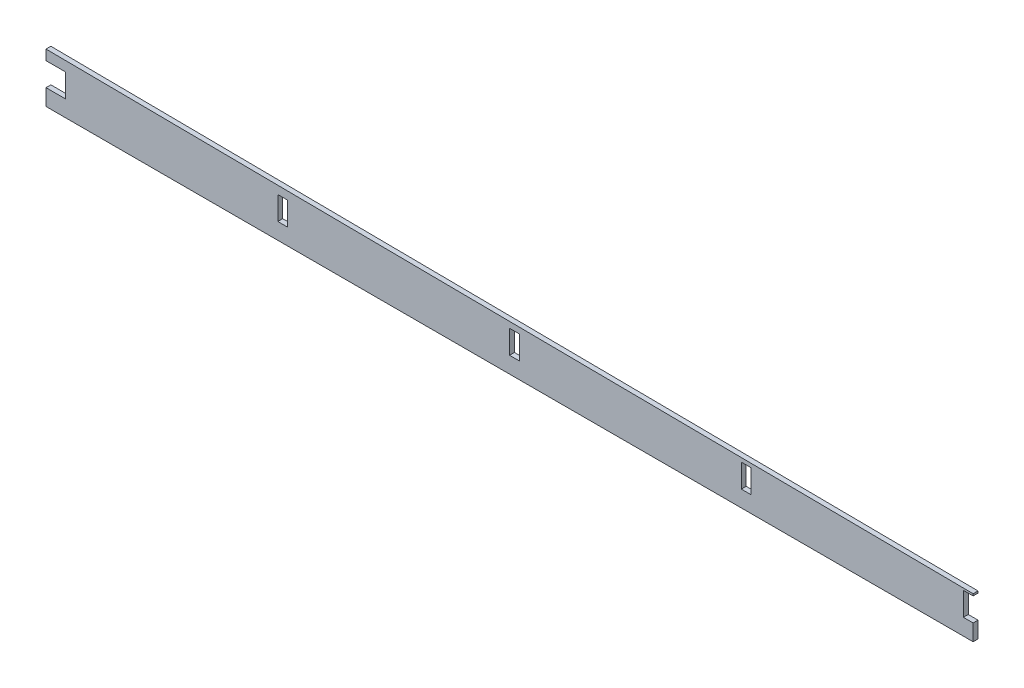
ISO-10303-21;
HEADER;
FILE_DESCRIPTION(('STEP AP214'),'2;1');
FILE_NAME('part.step','',(''),(''),'','','');
FILE_SCHEMA(('AUTOMOTIVE_DESIGN { 1 0 10303 214 1 1 1 1 }'));
ENDSEC;
DATA;
#1=APPLICATION_CONTEXT('core data for automotive mechanical design processes');
#2=APPLICATION_PROTOCOL_DEFINITION('international standard','automotive_design',2000,#1);
#3=PRODUCT_CONTEXT('',#1,'mechanical');
#4=PRODUCT('Part','Part','',(#3));
#5=PRODUCT_RELATED_PRODUCT_CATEGORY('part','',(#4));
#6=PRODUCT_DEFINITION_FORMATION('','',#4);
#7=PRODUCT_DEFINITION_CONTEXT('part definition',#1,'design');
#8=PRODUCT_DEFINITION('design','',#6,#7);
#9=PRODUCT_DEFINITION_SHAPE('','',#8);
#10=(LENGTH_UNIT() NAMED_UNIT(*) SI_UNIT(.MILLI.,.METRE.));
#11=(NAMED_UNIT(*) PLANE_ANGLE_UNIT() SI_UNIT($,.RADIAN.));
#12=(NAMED_UNIT(*) SI_UNIT($,.STERADIAN.) SOLID_ANGLE_UNIT());
#13=UNCERTAINTY_MEASURE_WITH_UNIT(LENGTH_MEASURE(1.E-05),#10,'distance_accuracy_value','');
#14=(GEOMETRIC_REPRESENTATION_CONTEXT(3) GLOBAL_UNCERTAINTY_ASSIGNED_CONTEXT((#13)) GLOBAL_UNIT_ASSIGNED_CONTEXT((#10,
#11,#12)) REPRESENTATION_CONTEXT('',''));
#15=CARTESIAN_POINT('',(0.,0.,0.));
#16=DIRECTION('',(0.,0.,1.));
#17=DIRECTION('',(1.,0.,0.));
#18=AXIS2_PLACEMENT_3D('',#15,#16,#17);
#19=CARTESIAN_POINT('',(0.,0.,1.5875));
#20=DIRECTION('',(0.,0.,-1.));
#21=DIRECTION('',(-1.,0.,0.));
#22=AXIS2_PLACEMENT_3D('',#19,#20,#21);
#23=PLANE('',#22);
#24=DIRECTION('',(1.,0.,0.));
#25=VECTOR('',#24,1.);
#26=CARTESIAN_POINT('',(88.195910265846,-74.0553626342623,1.5875));
#27=LINE('',#26,#25);
#28=CARTESIAN_POINT('',(88.195910265846,-74.0553626342623,1.5875));
#29=VERTEX_POINT('',#28);
#30=CARTESIAN_POINT('',(91.370910265846,-74.0553626342623,1.5875));
#31=VERTEX_POINT('',#30);
#32=EDGE_CURVE('E229',#29,#31,#27,.T.);
#33=ORIENTED_EDGE('',*,*,#32,.F.);
#34=DIRECTION('',(0.,-1.,0.));
#35=VECTOR('',#34,1.);
#36=CARTESIAN_POINT('',(88.195910265846,-74.0553626342623,1.5875));
#37=LINE('',#36,#35);
#38=CARTESIAN_POINT('',(88.195910265846,-66.4353626342623,1.5875));
#39=VERTEX_POINT('',#38);
#40=EDGE_CURVE('E237',#39,#29,#37,.T.);
#41=ORIENTED_EDGE('',*,*,#40,.F.);
#42=DIRECTION('',(-1.,0.,0.));
#43=VECTOR('',#42,1.);
#44=CARTESIAN_POINT('',(88.195910265846,-66.4353626342623,1.5875));
#45=LINE('',#44,#43);
#46=CARTESIAN_POINT('',(91.370910265846,-66.4353626342623,1.5875));
#47=VERTEX_POINT('',#46);
#48=EDGE_CURVE('E234',#47,#39,#45,.T.);
#49=ORIENTED_EDGE('',*,*,#48,.F.);
#50=DIRECTION('',(0.,1.,0.));
#51=VECTOR('',#50,1.);
#52=CARTESIAN_POINT('',(91.370910265846,-66.4353626342623,1.5875));
#53=LINE('',#52,#51);
#54=EDGE_CURVE('E231',#31,#47,#53,.T.);
#55=ORIENTED_EDGE('',*,*,#54,.F.);
#56=EDGE_LOOP('',(#33,#41,#49,#55));
#57=FACE_BOUND('',#56,.T.);
#58=DIRECTION('',(1.,0.,0.));
#59=VECTOR('',#58,1.);
#60=CARTESIAN_POINT('',(239.325910265846,-79.3766484022807,1.5875));
#61=LINE('',#60,#59);
#62=CARTESIAN_POINT('',(-62.9340897341539,-79.3766484022807,1.5875));
#63=VERTEX_POINT('',#62);
#64=CARTESIAN_POINT('',(239.325910265846,-79.3766484022807,1.5875));
#65=VERTEX_POINT('',#64);
#66=EDGE_CURVE('E291',#63,#65,#61,.T.);
#67=ORIENTED_EDGE('',*,*,#66,.T.);
#68=DIRECTION('',(0.,1.,0.));
#69=VECTOR('',#68,1.);
#70=CARTESIAN_POINT('',(239.325910265846,-74.0553626342623,1.5875));
#71=LINE('',#70,#69);
#72=CARTESIAN_POINT('',(239.325910265846,-74.0553626342623,1.5875));
#73=VERTEX_POINT('',#72);
#74=EDGE_CURVE('E294',#65,#73,#71,.T.);
#75=ORIENTED_EDGE('',*,*,#74,.T.);
#76=DIRECTION('',(-1.,0.,0.));
#77=VECTOR('',#76,1.);
#78=CARTESIAN_POINT('',(236.150910265846,-74.0553626342623,1.5875));
#79=LINE('',#78,#77);
#80=CARTESIAN_POINT('',(236.150910265846,-74.0553626342623,1.5875));
#81=VERTEX_POINT('',#80);
#82=EDGE_CURVE('E297',#73,#81,#79,.T.);
#83=ORIENTED_EDGE('',*,*,#82,.T.);
#84=DIRECTION('',(0.,1.,0.));
#85=VECTOR('',#84,1.);
#86=CARTESIAN_POINT('',(236.150910265846,-66.4353626342623,1.5875));
#87=LINE('',#86,#85);
#88=CARTESIAN_POINT('',(236.150910265846,-66.4353626342623,1.5875));
#89=VERTEX_POINT('',#88);
#90=EDGE_CURVE('E299',#81,#89,#87,.T.);
#91=ORIENTED_EDGE('',*,*,#90,.T.);
#92=DIRECTION('',(1.,0.,0.));
#93=VECTOR('',#92,1.);
#94=CARTESIAN_POINT('',(239.325910265846,-66.4353626342623,1.5875));
#95=LINE('',#94,#93);
#96=CARTESIAN_POINT('',(239.325910265846,-66.4353626342623,1.5875));
#97=VERTEX_POINT('',#96);
#98=EDGE_CURVE('E301',#89,#97,#95,.T.);
#99=ORIENTED_EDGE('',*,*,#98,.T.);
#100=DIRECTION('',(0.,1.,0.));
#101=VECTOR('',#100,1.);
#102=CARTESIAN_POINT('',(239.325910265846,-65.8101555135591,1.5875));
#103=LINE('',#102,#101);
#104=CARTESIAN_POINT('',(239.325910265846,-65.8101555135591,1.5875));
#105=VERTEX_POINT('',#104);
#106=EDGE_CURVE('E303',#97,#105,#103,.T.);
#107=ORIENTED_EDGE('',*,*,#106,.T.);
#108=DIRECTION('',(-0.999961259961512,0.008802191555811,0.));
#109=VECTOR('',#108,1.);
#110=CARTESIAN_POINT('',(-62.9340897341539,-63.1495020200809,1.5875));
#111=LINE('',#110,#109);
#112=CARTESIAN_POINT('',(-62.9340897341539,-63.1495020200809,1.5875));
#113=VERTEX_POINT('',#112);
#114=EDGE_CURVE('E305',#105,#113,#111,.T.);
#115=ORIENTED_EDGE('',*,*,#114,.T.);
#116=DIRECTION('',(0.,-1.,0.));
#117=VECTOR('',#116,1.);
#118=CARTESIAN_POINT('',(-62.9340897341539,-66.4353626342623,1.5875));
#119=LINE('',#118,#117);
#120=CARTESIAN_POINT('',(-62.9340897341539,-66.4353626342623,1.5875));
#121=VERTEX_POINT('',#120);
#122=EDGE_CURVE('E307',#113,#121,#119,.T.);
#123=ORIENTED_EDGE('',*,*,#122,.T.);
#124=DIRECTION('',(1.,0.,0.));
#125=VECTOR('',#124,1.);
#126=CARTESIAN_POINT('',(-56.5840897341539,-66.4353626342623,1.5875));
#127=LINE('',#126,#125);
#128=CARTESIAN_POINT('',(-56.5840897341539,-66.4353626342623,1.5875));
#129=VERTEX_POINT('',#128);
#130=EDGE_CURVE('E309',#121,#129,#127,.T.);
#131=ORIENTED_EDGE('',*,*,#130,.T.);
#132=DIRECTION('',(0.,-1.,0.));
#133=VECTOR('',#132,1.);
#134=CARTESIAN_POINT('',(-56.5840897341539,-74.0553626342623,1.5875));
#135=LINE('',#134,#133);
#136=CARTESIAN_POINT('',(-56.5840897341539,-74.0553626342623,1.5875));
#137=VERTEX_POINT('',#136);
#138=EDGE_CURVE('E311',#129,#137,#135,.T.);
#139=ORIENTED_EDGE('',*,*,#138,.T.);
#140=DIRECTION('',(-1.,0.,0.));
#141=VECTOR('',#140,1.);
#142=CARTESIAN_POINT('',(-62.9340897341539,-74.0553626342623,1.5875));
#143=LINE('',#142,#141);
#144=CARTESIAN_POINT('',(-62.9340897341539,-74.0553626342623,1.5875));
#145=VERTEX_POINT('',#144);
#146=EDGE_CURVE('E313',#137,#145,#143,.T.);
#147=ORIENTED_EDGE('',*,*,#146,.T.);
#148=DIRECTION('',(0.,-1.,0.));
#149=VECTOR('',#148,1.);
#150=CARTESIAN_POINT('',(-62.9340897341539,-79.3766484022807,1.5875));
#151=LINE('',#150,#149);
#152=EDGE_CURVE('E315',#145,#63,#151,.T.);
#153=ORIENTED_EDGE('',*,*,#152,.T.);
#154=EDGE_LOOP('',(#67,#75,#83,#91,#99,#107,#115,#123,#131,#139,#147,#153));
#155=FACE_BOUND('',#154,.T.);
#156=DIRECTION('',(1.,0.,0.));
#157=VECTOR('',#156,1.);
#158=CARTESIAN_POINT('',(15.8059102658461,-74.0553626342623,1.5875));
#159=LINE('',#158,#157);
#160=CARTESIAN_POINT('',(12.6309102658461,-74.0553626342623,1.5875));
#161=VERTEX_POINT('',#160);
#162=CARTESIAN_POINT('',(15.8059102658461,-74.0553626342623,1.5875));
#163=VERTEX_POINT('',#162);
#164=EDGE_CURVE('E260',#161,#163,#159,.T.);
#165=ORIENTED_EDGE('',*,*,#164,.F.);
#166=DIRECTION('',(0.,-1.,0.));
#167=VECTOR('',#166,1.);
#168=CARTESIAN_POINT('',(12.6309102658461,-74.0553626342623,1.5875));
#169=LINE('',#168,#167);
#170=CARTESIAN_POINT('',(12.6309102658461,-66.4353626342623,1.5875));
#171=VERTEX_POINT('',#170);
#172=EDGE_CURVE('E268',#171,#161,#169,.T.);
#173=ORIENTED_EDGE('',*,*,#172,.F.);
#174=DIRECTION('',(-1.,0.,0.));
#175=VECTOR('',#174,1.);
#176=CARTESIAN_POINT('',(12.6309102658461,-66.4353626342623,1.5875));
#177=LINE('',#176,#175);
#178=CARTESIAN_POINT('',(15.8059102658461,-66.4353626342623,1.5875));
#179=VERTEX_POINT('',#178);
#180=EDGE_CURVE('E265',#179,#171,#177,.T.);
#181=ORIENTED_EDGE('',*,*,#180,.F.);
#182=DIRECTION('',(0.,1.,0.));
#183=VECTOR('',#182,1.);
#184=CARTESIAN_POINT('',(15.8059102658461,-66.4353626342623,1.5875));
#185=LINE('',#184,#183);
#186=EDGE_CURVE('E262',#163,#179,#185,.T.);
#187=ORIENTED_EDGE('',*,*,#186,.F.);
#188=EDGE_LOOP('',(#165,#173,#181,#187));
#189=FACE_BOUND('',#188,.T.);
#190=DIRECTION('',(1.,0.,0.));
#191=VECTOR('',#190,1.);
#192=CARTESIAN_POINT('',(166.935910265846,-74.0553626342623,1.5875));
#193=LINE('',#192,#191);
#194=CARTESIAN_POINT('',(163.760910265846,-74.0553626342623,1.5875));
#195=VERTEX_POINT('',#194);
#196=CARTESIAN_POINT('',(166.935910265846,-74.0553626342623,1.5875));
#197=VERTEX_POINT('',#196);
#198=EDGE_CURVE('E193',#195,#197,#193,.T.);
#199=ORIENTED_EDGE('',*,*,#198,.F.);
#200=DIRECTION('',(0.,-1.,0.));
#201=VECTOR('',#200,1.);
#202=CARTESIAN_POINT('',(163.760910265846,-74.0553626342623,1.5875));
#203=LINE('',#202,#201);
#204=CARTESIAN_POINT('',(163.760910265846,-66.4353626342623,1.5875));
#205=VERTEX_POINT('',#204);
#206=EDGE_CURVE('E215',#205,#195,#203,.T.);
#207=ORIENTED_EDGE('',*,*,#206,.F.);
#208=DIRECTION('',(-1.,0.,0.));
#209=VECTOR('',#208,1.);
#210=CARTESIAN_POINT('',(163.760910265846,-66.4353626342623,1.5875));
#211=LINE('',#210,#209);
#212=CARTESIAN_POINT('',(166.935910265846,-66.4353626342623,1.5875));
#213=VERTEX_POINT('',#212);
#214=EDGE_CURVE('E213',#213,#205,#211,.T.);
#215=ORIENTED_EDGE('',*,*,#214,.F.);
#216=DIRECTION('',(0.,1.,0.));
#217=VECTOR('',#216,1.);
#218=CARTESIAN_POINT('',(166.935910265846,-66.4353626342623,1.5875));
#219=LINE('',#218,#217);
#220=EDGE_CURVE('E201',#197,#213,#219,.T.);
#221=ORIENTED_EDGE('',*,*,#220,.F.);
#222=EDGE_LOOP('',(#199,#207,#215,#221));
#223=FACE_BOUND('',#222,.T.);
#224=ADVANCED_FACE('F32',(#57,#155,#189,#223),#23,.F.);
#225=CARTESIAN_POINT('',(0.,0.,0.));
#226=DIRECTION('',(0.,0.,-1.));
#227=DIRECTION('',(-1.,0.,0.));
#228=AXIS2_PLACEMENT_3D('',#225,#226,#227);
#229=PLANE('',#228);
#230=DIRECTION('',(1.,0.,0.));
#231=VECTOR('',#230,1.);
#232=CARTESIAN_POINT('',(239.325910265846,-79.3766484022807,0.));
#233=LINE('',#232,#231);
#234=CARTESIAN_POINT('',(-62.9340897341539,-79.3766484022807,0.));
#235=VERTEX_POINT('',#234);
#236=CARTESIAN_POINT('',(239.325910265846,-79.3766484022807,0.));
#237=VERTEX_POINT('',#236);
#238=EDGE_CURVE('E290',#235,#237,#233,.T.);
#239=ORIENTED_EDGE('',*,*,#238,.F.);
#240=DIRECTION('',(0.,-1.,0.));
#241=VECTOR('',#240,1.);
#242=CARTESIAN_POINT('',(-62.9340897341539,-79.3766484022807,0.));
#243=LINE('',#242,#241);
#244=CARTESIAN_POINT('',(-62.9340897341539,-74.0553626342623,0.));
#245=VERTEX_POINT('',#244);
#246=EDGE_CURVE('E295',#245,#235,#243,.T.);
#247=ORIENTED_EDGE('',*,*,#246,.F.);
#248=DIRECTION('',(-1.,0.,0.));
#249=VECTOR('',#248,1.);
#250=CARTESIAN_POINT('',(-62.9340897341539,-74.0553626342623,0.));
#251=LINE('',#250,#249);
#252=CARTESIAN_POINT('',(-56.5840897341539,-74.0553626342623,0.));
#253=VERTEX_POINT('',#252);
#254=EDGE_CURVE('E338',#253,#245,#251,.T.);
#255=ORIENTED_EDGE('',*,*,#254,.F.);
#256=DIRECTION('',(0.,-1.,0.));
#257=VECTOR('',#256,1.);
#258=CARTESIAN_POINT('',(-56.5840897341539,-74.0553626342623,0.));
#259=LINE('',#258,#257);
#260=CARTESIAN_POINT('',(-56.5840897341539,-66.4353626342623,0.));
#261=VERTEX_POINT('',#260);
#262=EDGE_CURVE('E336',#261,#253,#259,.T.);
#263=ORIENTED_EDGE('',*,*,#262,.F.);
#264=DIRECTION('',(1.,0.,0.));
#265=VECTOR('',#264,1.);
#266=CARTESIAN_POINT('',(-56.5840897341539,-66.4353626342623,0.));
#267=LINE('',#266,#265);
#268=CARTESIAN_POINT('',(-62.9340897341539,-66.4353626342623,0.));
#269=VERTEX_POINT('',#268);
#270=EDGE_CURVE('E334',#269,#261,#267,.T.);
#271=ORIENTED_EDGE('',*,*,#270,.F.);
#272=DIRECTION('',(0.,-1.,0.));
#273=VECTOR('',#272,1.);
#274=CARTESIAN_POINT('',(-62.9340897341539,-66.4353626342623,0.));
#275=LINE('',#274,#273);
#276=CARTESIAN_POINT('',(-62.9340897341539,-63.1495020200809,0.));
#277=VERTEX_POINT('',#276);
#278=EDGE_CURVE('E332',#277,#269,#275,.T.);
#279=ORIENTED_EDGE('',*,*,#278,.F.);
#280=DIRECTION('',(-0.999961259961512,0.008802191555811,0.));
#281=VECTOR('',#280,1.);
#282=CARTESIAN_POINT('',(-62.9340897341539,-63.1495020200809,0.));
#283=LINE('',#282,#281);
#284=CARTESIAN_POINT('',(239.325910265846,-65.8101555135591,0.));
#285=VERTEX_POINT('',#284);
#286=EDGE_CURVE('E330',#285,#277,#283,.T.);
#287=ORIENTED_EDGE('',*,*,#286,.F.);
#288=DIRECTION('',(0.,1.,0.));
#289=VECTOR('',#288,1.);
#290=CARTESIAN_POINT('',(239.325910265846,-65.8101555135591,0.));
#291=LINE('',#290,#289);
#292=CARTESIAN_POINT('',(239.325910265846,-66.4353626342623,0.));
#293=VERTEX_POINT('',#292);
#294=EDGE_CURVE('E328',#293,#285,#291,.T.);
#295=ORIENTED_EDGE('',*,*,#294,.F.);
#296=DIRECTION('',(1.,0.,0.));
#297=VECTOR('',#296,1.);
#298=CARTESIAN_POINT('',(239.325910265846,-66.4353626342623,0.));
#299=LINE('',#298,#297);
#300=CARTESIAN_POINT('',(236.150910265846,-66.4353626342623,0.));
#301=VERTEX_POINT('',#300);
#302=EDGE_CURVE('E326',#301,#293,#299,.T.);
#303=ORIENTED_EDGE('',*,*,#302,.F.);
#304=DIRECTION('',(0.,1.,0.));
#305=VECTOR('',#304,1.);
#306=CARTESIAN_POINT('',(236.150910265846,-66.4353626342623,0.));
#307=LINE('',#306,#305);
#308=CARTESIAN_POINT('',(236.150910265846,-74.0553626342623,0.));
#309=VERTEX_POINT('',#308);
#310=EDGE_CURVE('E324',#309,#301,#307,.T.);
#311=ORIENTED_EDGE('',*,*,#310,.F.);
#312=DIRECTION('',(-1.,0.,0.));
#313=VECTOR('',#312,1.);
#314=CARTESIAN_POINT('',(236.150910265846,-74.0553626342623,0.));
#315=LINE('',#314,#313);
#316=CARTESIAN_POINT('',(239.325910265846,-74.0553626342623,0.));
#317=VERTEX_POINT('',#316);
#318=EDGE_CURVE('E322',#317,#309,#315,.T.);
#319=ORIENTED_EDGE('',*,*,#318,.F.);
#320=DIRECTION('',(0.,1.,0.));
#321=VECTOR('',#320,1.);
#322=CARTESIAN_POINT('',(239.325910265846,-74.0553626342623,0.));
#323=LINE('',#322,#321);
#324=EDGE_CURVE('E320',#237,#317,#323,.T.);
#325=ORIENTED_EDGE('',*,*,#324,.F.);
#326=EDGE_LOOP('',(#239,#247,#255,#263,#271,#279,#287,#295,#303,#311,#319,#325));
#327=FACE_BOUND('',#326,.T.);
#328=DIRECTION('',(0.,-1.,0.));
#329=VECTOR('',#328,1.);
#330=CARTESIAN_POINT('',(12.6309102658461,-74.0553626342623,0.));
#331=LINE('',#330,#329);
#332=CARTESIAN_POINT('',(12.6309102658461,-66.4353626342623,0.));
#333=VERTEX_POINT('',#332);
#334=CARTESIAN_POINT('',(12.6309102658461,-74.0553626342623,0.));
#335=VERTEX_POINT('',#334);
#336=EDGE_CURVE('E263',#333,#335,#331,.T.);
#337=ORIENTED_EDGE('',*,*,#336,.T.);
#338=DIRECTION('',(1.,0.,0.));
#339=VECTOR('',#338,1.);
#340=CARTESIAN_POINT('',(15.8059102658461,-74.0553626342623,0.));
#341=LINE('',#340,#339);
#342=CARTESIAN_POINT('',(15.8059102658461,-74.0553626342623,0.));
#343=VERTEX_POINT('',#342);
#344=EDGE_CURVE('E259',#335,#343,#341,.T.);
#345=ORIENTED_EDGE('',*,*,#344,.T.);
#346=DIRECTION('',(0.,1.,0.));
#347=VECTOR('',#346,1.);
#348=CARTESIAN_POINT('',(15.8059102658461,-66.4353626342623,0.));
#349=LINE('',#348,#347);
#350=CARTESIAN_POINT('',(15.8059102658461,-66.4353626342623,0.));
#351=VERTEX_POINT('',#350);
#352=EDGE_CURVE('E273',#343,#351,#349,.T.);
#353=ORIENTED_EDGE('',*,*,#352,.T.);
#354=DIRECTION('',(-1.,0.,0.));
#355=VECTOR('',#354,1.);
#356=CARTESIAN_POINT('',(12.6309102658461,-66.4353626342623,0.));
#357=LINE('',#356,#355);
#358=EDGE_CURVE('E276',#351,#333,#357,.T.);
#359=ORIENTED_EDGE('',*,*,#358,.T.);
#360=EDGE_LOOP('',(#337,#345,#353,#359));
#361=FACE_BOUND('',#360,.T.);
#362=DIRECTION('',(0.,-1.,0.));
#363=VECTOR('',#362,1.);
#364=CARTESIAN_POINT('',(88.195910265846,-74.0553626342623,0.));
#365=LINE('',#364,#363);
#366=CARTESIAN_POINT('',(88.195910265846,-66.4353626342623,0.));
#367=VERTEX_POINT('',#366);
#368=CARTESIAN_POINT('',(88.195910265846,-74.0553626342623,0.));
#369=VERTEX_POINT('',#368);
#370=EDGE_CURVE('E232',#367,#369,#365,.T.);
#371=ORIENTED_EDGE('',*,*,#370,.T.);
#372=DIRECTION('',(1.,0.,0.));
#373=VECTOR('',#372,1.);
#374=CARTESIAN_POINT('',(88.195910265846,-74.0553626342623,0.));
#375=LINE('',#374,#373);
#376=CARTESIAN_POINT('',(91.370910265846,-74.0553626342623,0.));
#377=VERTEX_POINT('',#376);
#378=EDGE_CURVE('E209',#369,#377,#375,.T.);
#379=ORIENTED_EDGE('',*,*,#378,.T.);
#380=DIRECTION('',(0.,1.,0.));
#381=VECTOR('',#380,1.);
#382=CARTESIAN_POINT('',(91.370910265846,-66.4353626342623,0.));
#383=LINE('',#382,#381);
#384=CARTESIAN_POINT('',(91.370910265846,-66.4353626342623,0.));
#385=VERTEX_POINT('',#384);
#386=EDGE_CURVE('E242',#377,#385,#383,.T.);
#387=ORIENTED_EDGE('',*,*,#386,.T.);
#388=DIRECTION('',(-1.,0.,0.));
#389=VECTOR('',#388,1.);
#390=CARTESIAN_POINT('',(88.195910265846,-66.4353626342623,0.));
#391=LINE('',#390,#389);
#392=EDGE_CURVE('E245',#385,#367,#391,.T.);
#393=ORIENTED_EDGE('',*,*,#392,.T.);
#394=EDGE_LOOP('',(#371,#379,#387,#393));
#395=FACE_BOUND('',#394,.T.);
#396=DIRECTION('',(0.,-1.,0.));
#397=VECTOR('',#396,1.);
#398=CARTESIAN_POINT('',(163.760910265846,-74.0553626342623,0.));
#399=LINE('',#398,#397);
#400=CARTESIAN_POINT('',(163.760910265846,-66.4353626342623,0.));
#401=VERTEX_POINT('',#400);
#402=CARTESIAN_POINT('',(163.760910265846,-74.0553626342623,0.));
#403=VERTEX_POINT('',#402);
#404=EDGE_CURVE('E202',#401,#403,#399,.T.);
#405=ORIENTED_EDGE('',*,*,#404,.T.);
#406=DIRECTION('',(1.,0.,0.));
#407=VECTOR('',#406,1.);
#408=CARTESIAN_POINT('',(166.935910265846,-74.0553626342623,0.));
#409=LINE('',#408,#407);
#410=CARTESIAN_POINT('',(166.935910265846,-74.0553626342623,0.));
#411=VERTEX_POINT('',#410);
#412=EDGE_CURVE('E55',#403,#411,#409,.T.);
#413=ORIENTED_EDGE('',*,*,#412,.T.);
#414=DIRECTION('',(0.,1.,0.));
#415=VECTOR('',#414,1.);
#416=CARTESIAN_POINT('',(166.935910265846,-66.4353626342623,0.));
#417=LINE('',#416,#415);
#418=CARTESIAN_POINT('',(166.935910265846,-66.4353626342623,0.));
#419=VERTEX_POINT('',#418);
#420=EDGE_CURVE('E208',#411,#419,#417,.T.);
#421=ORIENTED_EDGE('',*,*,#420,.T.);
#422=DIRECTION('',(-1.,0.,0.));
#423=VECTOR('',#422,1.);
#424=CARTESIAN_POINT('',(163.760910265846,-66.4353626342623,0.));
#425=LINE('',#424,#423);
#426=EDGE_CURVE('E221',#419,#401,#425,.T.);
#427=ORIENTED_EDGE('',*,*,#426,.T.);
#428=EDGE_LOOP('',(#405,#413,#421,#427));
#429=FACE_BOUND('',#428,.T.);
#430=ADVANCED_FACE('F380',(#327,#361,#395,#429),#229,.T.);
#431=CARTESIAN_POINT('',(239.325910265846,-79.3766484022807,1.5875));
#432=DIRECTION('',(0.,1.,0.));
#433=DIRECTION('',(-1.,0.,0.));
#434=AXIS2_PLACEMENT_3D('',#431,#432,#433);
#435=PLANE('',#434);
#436=ORIENTED_EDGE('',*,*,#238,.T.);
#437=DIRECTION('',(0.,0.,-1.));
#438=VECTOR('',#437,1.);
#439=CARTESIAN_POINT('',(239.325910265846,-79.3766484022807,1.5875));
#440=LINE('',#439,#438);
#441=EDGE_CURVE('E11',#65,#237,#440,.T.);
#442=ORIENTED_EDGE('',*,*,#441,.F.);
#443=ORIENTED_EDGE('',*,*,#66,.F.);
#444=DIRECTION('',(0.,0.,-1.));
#445=VECTOR('',#444,1.);
#446=CARTESIAN_POINT('',(-62.9340897341539,-79.3766484022807,1.5875));
#447=LINE('',#446,#445);
#448=EDGE_CURVE('E317',#63,#235,#447,.T.);
#449=ORIENTED_EDGE('',*,*,#448,.T.);
#450=EDGE_LOOP('',(#436,#442,#443,#449));
#451=FACE_BOUND('',#450,.T.);
#452=ADVANCED_FACE('F34',(#451),#435,.F.);
#453=CARTESIAN_POINT('',(239.325910265846,-74.0553626342623,1.5875));
#454=DIRECTION('',(-1.,0.,0.));
#455=DIRECTION('',(0.,0.,1.));
#456=AXIS2_PLACEMENT_3D('',#453,#454,#455);
#457=PLANE('',#456);
#458=ORIENTED_EDGE('',*,*,#324,.T.);
#459=DIRECTION('',(0.,0.,-1.));
#460=VECTOR('',#459,1.);
#461=CARTESIAN_POINT('',(239.325910265846,-74.0553626342623,1.5875));
#462=LINE('',#461,#460);
#463=EDGE_CURVE('E40',#73,#317,#462,.T.);
#464=ORIENTED_EDGE('',*,*,#463,.F.);
#465=ORIENTED_EDGE('',*,*,#74,.F.);
#466=ORIENTED_EDGE('',*,*,#441,.T.);
#467=EDGE_LOOP('',(#458,#464,#465,#466));
#468=FACE_BOUND('',#467,.T.);
#469=ADVANCED_FACE('F398',(#468),#457,.F.);
#470=CARTESIAN_POINT('',(236.150910265846,-74.0553626342623,1.5875));
#471=DIRECTION('',(0.,-1.,0.));
#472=DIRECTION('',(1.,0.,0.));
#473=AXIS2_PLACEMENT_3D('',#470,#471,#472);
#474=PLANE('',#473);
#475=ORIENTED_EDGE('',*,*,#318,.T.);
#476=DIRECTION('',(0.,0.,-1.));
#477=VECTOR('',#476,1.);
#478=CARTESIAN_POINT('',(236.150910265846,-74.0553626342623,1.5875));
#479=LINE('',#478,#477);
#480=EDGE_CURVE('E367',#81,#309,#479,.T.);
#481=ORIENTED_EDGE('',*,*,#480,.F.);
#482=ORIENTED_EDGE('',*,*,#82,.F.);
#483=ORIENTED_EDGE('',*,*,#463,.T.);
#484=EDGE_LOOP('',(#475,#481,#482,#483));
#485=FACE_BOUND('',#484,.T.);
#486=ADVANCED_FACE('F374',(#485),#474,.F.);
#487=CARTESIAN_POINT('',(236.150910265846,-66.4353626342623,1.5875));
#488=DIRECTION('',(-1.,0.,0.));
#489=DIRECTION('',(0.,-1.,0.));
#490=AXIS2_PLACEMENT_3D('',#487,#488,#489);
#491=PLANE('',#490);
#492=ORIENTED_EDGE('',*,*,#310,.T.);
#493=DIRECTION('',(0.,0.,-1.));
#494=VECTOR('',#493,1.);
#495=CARTESIAN_POINT('',(236.150910265846,-66.4353626342623,1.5875));
#496=LINE('',#495,#494);
#497=EDGE_CURVE('E364',#89,#301,#496,.T.);
#498=ORIENTED_EDGE('',*,*,#497,.F.);
#499=ORIENTED_EDGE('',*,*,#90,.F.);
#500=ORIENTED_EDGE('',*,*,#480,.T.);
#501=EDGE_LOOP('',(#492,#498,#499,#500));
#502=FACE_BOUND('',#501,.T.);
#503=ADVANCED_FACE('F386',(#502),#491,.F.);
#504=CARTESIAN_POINT('',(239.325910265846,-66.4353626342623,1.5875));
#505=DIRECTION('',(0.,1.,0.));
#506=DIRECTION('',(0.,0.,1.));
#507=AXIS2_PLACEMENT_3D('',#504,#505,#506);
#508=PLANE('',#507);
#509=ORIENTED_EDGE('',*,*,#302,.T.);
#510=DIRECTION('',(0.,0.,-1.));
#511=VECTOR('',#510,1.);
#512=CARTESIAN_POINT('',(239.325910265846,-66.4353626342623,1.5875));
#513=LINE('',#512,#511);
#514=EDGE_CURVE('E361',#97,#293,#513,.T.);
#515=ORIENTED_EDGE('',*,*,#514,.F.);
#516=ORIENTED_EDGE('',*,*,#98,.F.);
#517=ORIENTED_EDGE('',*,*,#497,.T.);
#518=EDGE_LOOP('',(#509,#515,#516,#517));
#519=FACE_BOUND('',#518,.T.);
#520=ADVANCED_FACE('F390',(#519),#508,.F.);
#521=CARTESIAN_POINT('',(239.325910265846,-65.8101555135591,1.5875));
#522=DIRECTION('',(-1.,0.,0.));
#523=DIRECTION('',(0.,0.,1.));
#524=AXIS2_PLACEMENT_3D('',#521,#522,#523);
#525=PLANE('',#524);
#526=ORIENTED_EDGE('',*,*,#294,.T.);
#527=DIRECTION('',(0.,0.,-1.));
#528=VECTOR('',#527,1.);
#529=CARTESIAN_POINT('',(239.325910265846,-65.8101555135591,1.5875));
#530=LINE('',#529,#528);
#531=EDGE_CURVE('E358',#105,#285,#530,.T.);
#532=ORIENTED_EDGE('',*,*,#531,.F.);
#533=ORIENTED_EDGE('',*,*,#106,.F.);
#534=ORIENTED_EDGE('',*,*,#514,.T.);
#535=EDGE_LOOP('',(#526,#532,#533,#534));
#536=FACE_BOUND('',#535,.T.);
#537=ADVANCED_FACE('F431',(#536),#525,.F.);
#538=CARTESIAN_POINT('',(-62.9340897341539,-63.1495020200809,1.5875));
#539=DIRECTION('',(-0.008802191555811,-0.999961259961512,0.));
#540=DIRECTION('',(0.999961259961512,-0.008802191555811,0.));
#541=AXIS2_PLACEMENT_3D('',#538,#539,#540);
#542=PLANE('',#541);
#543=ORIENTED_EDGE('',*,*,#286,.T.);
#544=DIRECTION('',(0.,0.,-1.));
#545=VECTOR('',#544,1.);
#546=CARTESIAN_POINT('',(-62.9340897341539,-63.1495020200809,1.5875));
#547=LINE('',#546,#545);
#548=EDGE_CURVE('E355',#113,#277,#547,.T.);
#549=ORIENTED_EDGE('',*,*,#548,.F.);
#550=ORIENTED_EDGE('',*,*,#114,.F.);
#551=ORIENTED_EDGE('',*,*,#531,.T.);
#552=EDGE_LOOP('',(#543,#549,#550,#551));
#553=FACE_BOUND('',#552,.T.);
#554=ADVANCED_FACE('F429',(#553),#542,.F.);
#555=CARTESIAN_POINT('',(-62.9340897341539,-66.4353626342623,1.5875));
#556=DIRECTION('',(1.,0.,0.));
#557=DIRECTION('',(0.,0.,-1.));
#558=AXIS2_PLACEMENT_3D('',#555,#556,#557);
#559=PLANE('',#558);
#560=ORIENTED_EDGE('',*,*,#278,.T.);
#561=DIRECTION('',(0.,0.,-1.));
#562=VECTOR('',#561,1.);
#563=CARTESIAN_POINT('',(-62.9340897341539,-66.4353626342623,1.5875));
#564=LINE('',#563,#562);
#565=EDGE_CURVE('E352',#121,#269,#564,.T.);
#566=ORIENTED_EDGE('',*,*,#565,.F.);
#567=ORIENTED_EDGE('',*,*,#122,.F.);
#568=ORIENTED_EDGE('',*,*,#548,.T.);
#569=EDGE_LOOP('',(#560,#566,#567,#568));
#570=FACE_BOUND('',#569,.T.);
#571=ADVANCED_FACE('F425',(#570),#559,.F.);
#572=CARTESIAN_POINT('',(-56.5840897341539,-66.4353626342623,1.5875));
#573=DIRECTION('',(0.,1.,0.));
#574=DIRECTION('',(-1.,0.,0.));
#575=AXIS2_PLACEMENT_3D('',#572,#573,#574);
#576=PLANE('',#575);
#577=ORIENTED_EDGE('',*,*,#270,.T.);
#578=DIRECTION('',(0.,0.,-1.));
#579=VECTOR('',#578,1.);
#580=CARTESIAN_POINT('',(-56.5840897341539,-66.4353626342623,1.5875));
#581=LINE('',#580,#579);
#582=EDGE_CURVE('E349',#129,#261,#581,.T.);
#583=ORIENTED_EDGE('',*,*,#582,.F.);
#584=ORIENTED_EDGE('',*,*,#130,.F.);
#585=ORIENTED_EDGE('',*,*,#565,.T.);
#586=EDGE_LOOP('',(#577,#583,#584,#585));
#587=FACE_BOUND('',#586,.T.);
#588=ADVANCED_FACE('F420',(#587),#576,.F.);
#589=CARTESIAN_POINT('',(-56.5840897341539,-74.0553626342623,1.5875));
#590=DIRECTION('',(1.,0.,0.));
#591=DIRECTION('',(0.,0.,-1.));
#592=AXIS2_PLACEMENT_3D('',#589,#590,#591);
#593=PLANE('',#592);
#594=ORIENTED_EDGE('',*,*,#262,.T.);
#595=DIRECTION('',(0.,0.,-1.));
#596=VECTOR('',#595,1.);
#597=CARTESIAN_POINT('',(-56.5840897341539,-74.0553626342623,1.5875));
#598=LINE('',#597,#596);
#599=EDGE_CURVE('E346',#137,#253,#598,.T.);
#600=ORIENTED_EDGE('',*,*,#599,.F.);
#601=ORIENTED_EDGE('',*,*,#138,.F.);
#602=ORIENTED_EDGE('',*,*,#582,.T.);
#603=EDGE_LOOP('',(#594,#600,#601,#602));
#604=FACE_BOUND('',#603,.T.);
#605=ADVANCED_FACE('F414',(#604),#593,.F.);
#606=CARTESIAN_POINT('',(-62.9340897341539,-74.0553626342623,1.5875));
#607=DIRECTION('',(0.,-1.,0.));
#608=DIRECTION('',(0.,0.,-1.));
#609=AXIS2_PLACEMENT_3D('',#606,#607,#608);
#610=PLANE('',#609);
#611=ORIENTED_EDGE('',*,*,#254,.T.);
#612=DIRECTION('',(0.,0.,-1.));
#613=VECTOR('',#612,1.);
#614=CARTESIAN_POINT('',(-62.9340897341539,-74.0553626342623,1.5875));
#615=LINE('',#614,#613);
#616=EDGE_CURVE('E343',#145,#245,#615,.T.);
#617=ORIENTED_EDGE('',*,*,#616,.F.);
#618=ORIENTED_EDGE('',*,*,#146,.F.);
#619=ORIENTED_EDGE('',*,*,#599,.T.);
#620=EDGE_LOOP('',(#611,#617,#618,#619));
#621=FACE_BOUND('',#620,.T.);
#622=ADVANCED_FACE('F410',(#621),#610,.F.);
#623=CARTESIAN_POINT('',(-62.9340897341539,-79.3766484022807,1.5875));
#624=DIRECTION('',(1.,0.,0.));
#625=DIRECTION('',(0.,0.,-1.));
#626=AXIS2_PLACEMENT_3D('',#623,#624,#625);
#627=PLANE('',#626);
#628=ORIENTED_EDGE('',*,*,#246,.T.);
#629=ORIENTED_EDGE('',*,*,#448,.F.);
#630=ORIENTED_EDGE('',*,*,#152,.F.);
#631=ORIENTED_EDGE('',*,*,#616,.T.);
#632=EDGE_LOOP('',(#628,#629,#630,#631));
#633=FACE_BOUND('',#632,.T.);
#634=ADVANCED_FACE('F405',(#633),#627,.F.);
#635=CARTESIAN_POINT('',(15.8059102658461,-74.0553626342623,1.5875));
#636=DIRECTION('',(0.,1.,0.));
#637=DIRECTION('',(-1.,0.,0.));
#638=AXIS2_PLACEMENT_3D('',#635,#636,#637);
#639=PLANE('',#638);
#640=ORIENTED_EDGE('',*,*,#344,.F.);
#641=DIRECTION('',(0.,0.,-1.));
#642=VECTOR('',#641,1.);
#643=CARTESIAN_POINT('',(12.6309102658461,-74.0553626342623,1.5875));
#644=LINE('',#643,#642);
#645=EDGE_CURVE('E270',#161,#335,#644,.T.);
#646=ORIENTED_EDGE('',*,*,#645,.F.);
#647=ORIENTED_EDGE('',*,*,#164,.T.);
#648=DIRECTION('',(0.,0.,-1.));
#649=VECTOR('',#648,1.);
#650=CARTESIAN_POINT('',(15.8059102658461,-74.0553626342623,1.5875));
#651=LINE('',#650,#649);
#652=EDGE_CURVE('E287',#163,#343,#651,.T.);
#653=ORIENTED_EDGE('',*,*,#652,.T.);
#654=EDGE_LOOP('',(#640,#646,#647,#653));
#655=FACE_BOUND('',#654,.T.);
#656=ADVANCED_FACE('F449',(#655),#639,.T.);
#657=CARTESIAN_POINT('',(15.8059102658461,-66.4353626342623,1.5875));
#658=DIRECTION('',(-1.,0.,0.));
#659=DIRECTION('',(0.,-1.,0.));
#660=AXIS2_PLACEMENT_3D('',#657,#658,#659);
#661=PLANE('',#660);
#662=ORIENTED_EDGE('',*,*,#352,.F.);
#663=ORIENTED_EDGE('',*,*,#652,.F.);
#664=ORIENTED_EDGE('',*,*,#186,.T.);
#665=DIRECTION('',(0.,0.,-1.));
#666=VECTOR('',#665,1.);
#667=CARTESIAN_POINT('',(15.8059102658461,-66.4353626342623,1.5875));
#668=LINE('',#667,#666);
#669=EDGE_CURVE('E285',#179,#351,#668,.T.);
#670=ORIENTED_EDGE('',*,*,#669,.T.);
#671=EDGE_LOOP('',(#662,#663,#664,#670));
#672=FACE_BOUND('',#671,.T.);
#673=ADVANCED_FACE('F487',(#672),#661,.T.);
#674=CARTESIAN_POINT('',(12.6309102658461,-66.4353626342623,1.5875));
#675=DIRECTION('',(0.,-1.,0.));
#676=DIRECTION('',(1.,0.,0.));
#677=AXIS2_PLACEMENT_3D('',#674,#675,#676);
#678=PLANE('',#677);
#679=ORIENTED_EDGE('',*,*,#358,.F.);
#680=ORIENTED_EDGE('',*,*,#669,.F.);
#681=ORIENTED_EDGE('',*,*,#180,.T.);
#682=DIRECTION('',(0.,0.,-1.));
#683=VECTOR('',#682,1.);
#684=CARTESIAN_POINT('',(12.6309102658461,-66.4353626342623,1.5875));
#685=LINE('',#684,#683);
#686=EDGE_CURVE('E283',#171,#333,#685,.T.);
#687=ORIENTED_EDGE('',*,*,#686,.T.);
#688=EDGE_LOOP('',(#679,#680,#681,#687));
#689=FACE_BOUND('',#688,.T.);
#690=ADVANCED_FACE('F494',(#689),#678,.T.);
#691=CARTESIAN_POINT('',(12.6309102658461,-74.0553626342623,1.5875));
#692=DIRECTION('',(1.,0.,0.));
#693=DIRECTION('',(0.,0.,-1.));
#694=AXIS2_PLACEMENT_3D('',#691,#692,#693);
#695=PLANE('',#694);
#696=ORIENTED_EDGE('',*,*,#336,.F.);
#697=ORIENTED_EDGE('',*,*,#686,.F.);
#698=ORIENTED_EDGE('',*,*,#172,.T.);
#699=ORIENTED_EDGE('',*,*,#645,.T.);
#700=EDGE_LOOP('',(#696,#697,#698,#699));
#701=FACE_BOUND('',#700,.T.);
#702=ADVANCED_FACE('F501',(#701),#695,.T.);
#703=CARTESIAN_POINT('',(88.195910265846,-74.0553626342623,1.5875));
#704=DIRECTION('',(0.,1.,0.));
#705=DIRECTION('',(0.,0.,1.));
#706=AXIS2_PLACEMENT_3D('',#703,#704,#705);
#707=PLANE('',#706);
#708=ORIENTED_EDGE('',*,*,#378,.F.);
#709=DIRECTION('',(0.,0.,-1.));
#710=VECTOR('',#709,1.);
#711=CARTESIAN_POINT('',(88.195910265846,-74.0553626342623,1.5875));
#712=LINE('',#711,#710);
#713=EDGE_CURVE('E239',#29,#369,#712,.T.);
#714=ORIENTED_EDGE('',*,*,#713,.F.);
#715=ORIENTED_EDGE('',*,*,#32,.T.);
#716=DIRECTION('',(0.,0.,-1.));
#717=VECTOR('',#716,1.);
#718=CARTESIAN_POINT('',(91.370910265846,-74.0553626342623,1.5875));
#719=LINE('',#718,#717);
#720=EDGE_CURVE('E256',#31,#377,#719,.T.);
#721=ORIENTED_EDGE('',*,*,#720,.T.);
#722=EDGE_LOOP('',(#708,#714,#715,#721));
#723=FACE_BOUND('',#722,.T.);
#724=ADVANCED_FACE('F509',(#723),#707,.T.);
#725=CARTESIAN_POINT('',(91.370910265846,-66.4353626342623,1.5875));
#726=DIRECTION('',(-1.,0.,0.));
#727=DIRECTION('',(0.,-1.,0.));
#728=AXIS2_PLACEMENT_3D('',#725,#726,#727);
#729=PLANE('',#728);
#730=ORIENTED_EDGE('',*,*,#386,.F.);
#731=ORIENTED_EDGE('',*,*,#720,.F.);
#732=ORIENTED_EDGE('',*,*,#54,.T.);
#733=DIRECTION('',(0.,0.,-1.));
#734=VECTOR('',#733,1.);
#735=CARTESIAN_POINT('',(91.370910265846,-66.4353626342623,1.5875));
#736=LINE('',#735,#734);
#737=EDGE_CURVE('E254',#47,#385,#736,.T.);
#738=ORIENTED_EDGE('',*,*,#737,.T.);
#739=EDGE_LOOP('',(#730,#731,#732,#738));
#740=FACE_BOUND('',#739,.T.);
#741=ADVANCED_FACE('F517',(#740),#729,.T.);
#742=CARTESIAN_POINT('',(88.195910265846,-66.4353626342623,1.5875));
#743=DIRECTION('',(0.,-1.,0.));
#744=DIRECTION('',(1.,0.,0.));
#745=AXIS2_PLACEMENT_3D('',#742,#743,#744);
#746=PLANE('',#745);
#747=ORIENTED_EDGE('',*,*,#392,.F.);
#748=ORIENTED_EDGE('',*,*,#737,.F.);
#749=ORIENTED_EDGE('',*,*,#48,.T.);
#750=DIRECTION('',(0.,0.,-1.));
#751=VECTOR('',#750,1.);
#752=CARTESIAN_POINT('',(88.195910265846,-66.4353626342623,1.5875));
#753=LINE('',#752,#751);
#754=EDGE_CURVE('E252',#39,#367,#753,.T.);
#755=ORIENTED_EDGE('',*,*,#754,.T.);
#756=EDGE_LOOP('',(#747,#748,#749,#755));
#757=FACE_BOUND('',#756,.T.);
#758=ADVANCED_FACE('F525',(#757),#746,.T.);
#759=CARTESIAN_POINT('',(88.195910265846,-74.0553626342623,1.5875));
#760=DIRECTION('',(1.,0.,0.));
#761=DIRECTION('',(0.,0.,-1.));
#762=AXIS2_PLACEMENT_3D('',#759,#760,#761);
#763=PLANE('',#762);
#764=ORIENTED_EDGE('',*,*,#370,.F.);
#765=ORIENTED_EDGE('',*,*,#754,.F.);
#766=ORIENTED_EDGE('',*,*,#40,.T.);
#767=ORIENTED_EDGE('',*,*,#713,.T.);
#768=EDGE_LOOP('',(#764,#765,#766,#767));
#769=FACE_BOUND('',#768,.T.);
#770=ADVANCED_FACE('F533',(#769),#763,.T.);
#771=CARTESIAN_POINT('',(166.935910265846,-74.0553626342623,1.5875));
#772=DIRECTION('',(0.,1.,0.));
#773=DIRECTION('',(0.,0.,1.));
#774=AXIS2_PLACEMENT_3D('',#771,#772,#773);
#775=PLANE('',#774);
#776=ORIENTED_EDGE('',*,*,#412,.F.);
#777=DIRECTION('',(0.,0.,-1.));
#778=VECTOR('',#777,1.);
#779=CARTESIAN_POINT('',(163.760910265846,-74.0553626342623,1.5875));
#780=LINE('',#779,#778);
#781=EDGE_CURVE('E197',#195,#403,#780,.T.);
#782=ORIENTED_EDGE('',*,*,#781,.F.);
#783=ORIENTED_EDGE('',*,*,#198,.T.);
#784=DIRECTION('',(0.,0.,-1.));
#785=VECTOR('',#784,1.);
#786=CARTESIAN_POINT('',(166.935910265846,-74.0553626342623,1.5875));
#787=LINE('',#786,#785);
#788=EDGE_CURVE('E196',#197,#411,#787,.T.);
#789=ORIENTED_EDGE('',*,*,#788,.T.);
#790=EDGE_LOOP('',(#776,#782,#783,#789));
#791=FACE_BOUND('',#790,.T.);
#792=ADVANCED_FACE('F195',(#791),#775,.T.);
#793=CARTESIAN_POINT('',(166.935910265846,-66.4353626342623,1.5875));
#794=DIRECTION('',(-1.,0.,0.));
#795=DIRECTION('',(0.,-1.,0.));
#796=AXIS2_PLACEMENT_3D('',#793,#794,#795);
#797=PLANE('',#796);
#798=ORIENTED_EDGE('',*,*,#420,.F.);
#799=ORIENTED_EDGE('',*,*,#788,.F.);
#800=ORIENTED_EDGE('',*,*,#220,.T.);
#801=DIRECTION('',(0.,0.,-1.));
#802=VECTOR('',#801,1.);
#803=CARTESIAN_POINT('',(166.935910265846,-66.4353626342623,1.5875));
#804=LINE('',#803,#802);
#805=EDGE_CURVE('E210',#213,#419,#804,.T.);
#806=ORIENTED_EDGE('',*,*,#805,.T.);
#807=EDGE_LOOP('',(#798,#799,#800,#806));
#808=FACE_BOUND('',#807,.T.);
#809=ADVANCED_FACE('F205',(#808),#797,.T.);
#810=CARTESIAN_POINT('',(163.760910265846,-66.4353626342623,1.5875));
#811=DIRECTION('',(0.,-1.,0.));
#812=DIRECTION('',(1.,0.,0.));
#813=AXIS2_PLACEMENT_3D('',#810,#811,#812);
#814=PLANE('',#813);
#815=ORIENTED_EDGE('',*,*,#426,.F.);
#816=ORIENTED_EDGE('',*,*,#805,.F.);
#817=ORIENTED_EDGE('',*,*,#214,.T.);
#818=DIRECTION('',(0.,0.,-1.));
#819=VECTOR('',#818,1.);
#820=CARTESIAN_POINT('',(163.760910265846,-66.4353626342623,1.5875));
#821=LINE('',#820,#819);
#822=EDGE_CURVE('E47',#205,#401,#821,.T.);
#823=ORIENTED_EDGE('',*,*,#822,.T.);
#824=EDGE_LOOP('',(#815,#816,#817,#823));
#825=FACE_BOUND('',#824,.T.);
#826=ADVANCED_FACE('F554',(#825),#814,.T.);
#827=CARTESIAN_POINT('',(163.760910265846,-74.0553626342623,1.5875));
#828=DIRECTION('',(1.,0.,0.));
#829=DIRECTION('',(0.,1.,0.));
#830=AXIS2_PLACEMENT_3D('',#827,#828,#829);
#831=PLANE('',#830);
#832=ORIENTED_EDGE('',*,*,#404,.F.);
#833=ORIENTED_EDGE('',*,*,#822,.F.);
#834=ORIENTED_EDGE('',*,*,#206,.T.);
#835=ORIENTED_EDGE('',*,*,#781,.T.);
#836=EDGE_LOOP('',(#832,#833,#834,#835));
#837=FACE_BOUND('',#836,.T.);
#838=ADVANCED_FACE('F561',(#837),#831,.T.);
#839=CLOSED_SHELL('',(#224,#430,#452,#469,#486,#503,#520,#537,#554,#571,#588,#605,#622,#634,
#656,#673,#690,#702,#724,#741,#758,#770,#792,#809,#826,#838));
#840=MANIFOLD_SOLID_BREP('B2',#839);
#841=ADVANCED_BREP_SHAPE_REPRESENTATION('',(#18,#840),#14);
#842=SHAPE_DEFINITION_REPRESENTATION(#9,#841);
ENDSEC;
END-ISO-10303-21;
